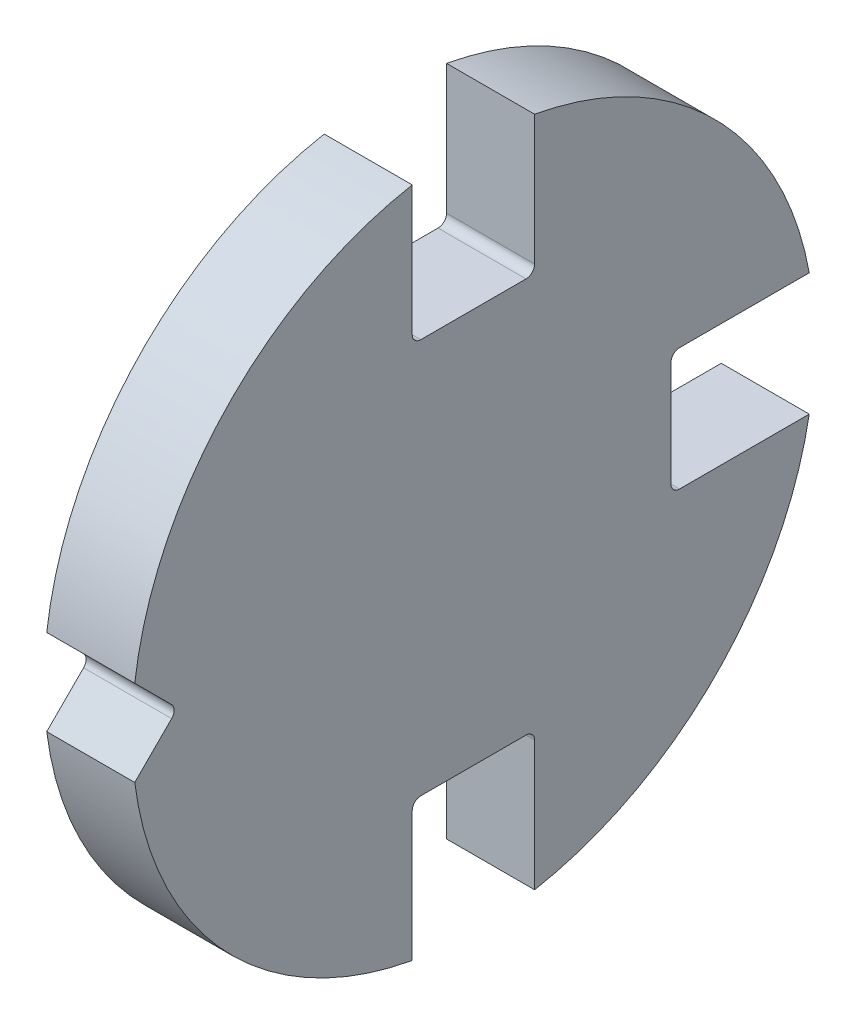
ISO-10303-21;
HEADER;
FILE_DESCRIPTION(('STEP AP214'),'2;1');
FILE_NAME('part.step','',(''),(''),'','','');
FILE_SCHEMA(('AUTOMOTIVE_DESIGN { 1 0 10303 214 1 1 1 1 }'));
ENDSEC;
DATA;
#1=APPLICATION_CONTEXT('core data for automotive mechanical design processes');
#2=APPLICATION_PROTOCOL_DEFINITION('international standard','automotive_design',2000,#1);
#3=PRODUCT_CONTEXT('',#1,'mechanical');
#4=PRODUCT('Part','Part','',(#3));
#5=PRODUCT_RELATED_PRODUCT_CATEGORY('part','',(#4));
#6=PRODUCT_DEFINITION_FORMATION('','',#4);
#7=PRODUCT_DEFINITION_CONTEXT('part definition',#1,'design');
#8=PRODUCT_DEFINITION('design','',#6,#7);
#9=PRODUCT_DEFINITION_SHAPE('','',#8);
#10=(LENGTH_UNIT() NAMED_UNIT(*) SI_UNIT(.MILLI.,.METRE.));
#11=(NAMED_UNIT(*) PLANE_ANGLE_UNIT() SI_UNIT($,.RADIAN.));
#12=(NAMED_UNIT(*) SI_UNIT($,.STERADIAN.) SOLID_ANGLE_UNIT());
#13=UNCERTAINTY_MEASURE_WITH_UNIT(LENGTH_MEASURE(1.E-05),#10,'distance_accuracy_value','');
#14=(GEOMETRIC_REPRESENTATION_CONTEXT(3) GLOBAL_UNCERTAINTY_ASSIGNED_CONTEXT((#13)) GLOBAL_UNIT_ASSIGNED_CONTEXT((#10,
#11,#12)) REPRESENTATION_CONTEXT('',''));
#15=CARTESIAN_POINT('',(0.,0.,0.));
#16=DIRECTION('',(0.,0.,1.));
#17=DIRECTION('',(1.,0.,0.));
#18=AXIS2_PLACEMENT_3D('',#15,#16,#17);
#19=CARTESIAN_POINT('',(69.14,0.,7.16969886701604));
#20=DIRECTION('',(1.,0.,0.));
#21=DIRECTION('',(0.,0.,-1.));
#22=AXIS2_PLACEMENT_3D('',#19,#20,#21);
#23=CYLINDRICAL_SURFACE('',#22,0.2);
#24=DIRECTION('',(1.,0.,0.));
#25=VECTOR('',#24,1.);
#26=CARTESIAN_POINT('',(70.165,0.14142135623743,7.02827751063743));
#27=LINE('',#26,#25);
#28=CARTESIAN_POINT('',(69.14,0.141421356272726,7.02827751067272));
#29=VERTEX_POINT('',#28);
#30=CARTESIAN_POINT('',(71.19,0.141421356231546,7.02827751070226));
#31=VERTEX_POINT('',#30);
#32=EDGE_CURVE('E176',#29,#31,#27,.T.);
#33=ORIENTED_EDGE('',*,*,#32,.F.);
#34=CARTESIAN_POINT('',(69.14,0.,7.16969886701604));
#35=DIRECTION('',(1.,0.,0.));
#36=DIRECTION('',(0.,0.,-1.));
#37=AXIS2_PLACEMENT_3D('',#34,#35,#36);
#38=CIRCLE('',#37,0.2);
#39=CARTESIAN_POINT('',(69.14,-0.141421356272666,7.02827751067266));
#40=VERTEX_POINT('',#39);
#41=EDGE_CURVE('E20',#40,#29,#38,.T.);
#42=ORIENTED_EDGE('',*,*,#41,.F.);
#43=DIRECTION('',(1.,0.,0.));
#44=VECTOR('',#43,1.);
#45=CARTESIAN_POINT('',(70.165,-0.141421356237311,7.02827751063731));
#46=LINE('',#45,#44);
#47=CARTESIAN_POINT('',(71.19,-0.141421356272666,7.02827751067267));
#48=VERTEX_POINT('',#47);
#49=EDGE_CURVE('E192',#48,#40,#46,.F.);
#50=ORIENTED_EDGE('',*,*,#49,.F.);
#51=CARTESIAN_POINT('',(71.19,0.,7.16969886701604));
#52=DIRECTION('',(1.,0.,0.));
#53=DIRECTION('',(0.,0.,-1.));
#54=AXIS2_PLACEMENT_3D('',#51,#52,#53);
#55=CIRCLE('',#54,0.2);
#56=EDGE_CURVE('E174',#31,#48,#55,.F.);
#57=ORIENTED_EDGE('',*,*,#56,.F.);
#58=EDGE_LOOP('',(#33,#42,#50,#57));
#59=FACE_BOUND('',#58,.T.);
#60=ADVANCED_FACE('F17',(#59),#23,.F.);
#61=CARTESIAN_POINT('',(70.165,0.500000000009512,7.38685615440951));
#62=DIRECTION('',(0.,-0.707106781186548,0.707106781186547));
#63=DIRECTION('',(0.,-0.707106781186547,-0.707106781186548));
#64=AXIS2_PLACEMENT_3D('',#61,#62,#63);
#65=PLANE('',#64);
#66=DIRECTION('',(1.,0.,0.));
#67=VECTOR('',#66,1.);
#68=CARTESIAN_POINT('',(70.165,1.00000000001478,7.88685615438563));
#69=LINE('',#68,#67);
#70=CARTESIAN_POINT('',(69.14,1.00000000000185,7.88685615438727));
#71=VERTEX_POINT('',#70);
#72=CARTESIAN_POINT('',(71.19,1.00000000000184,7.88685615438727));
#73=VERTEX_POINT('',#72);
#74=EDGE_CURVE('E182',#71,#73,#69,.T.);
#75=ORIENTED_EDGE('',*,*,#74,.F.);
#76=DIRECTION('',(0.,-0.707106781186547,-0.707106781186548));
#77=VECTOR('',#76,1.);
#78=CARTESIAN_POINT('',(69.14,0.500000000009512,7.38685615440951));
#79=LINE('',#78,#77);
#80=EDGE_CURVE('E170',#71,#29,#79,.T.);
#81=ORIENTED_EDGE('',*,*,#80,.T.);
#82=ORIENTED_EDGE('',*,*,#32,.T.);
#83=DIRECTION('',(0.,-0.70710678124478,-0.707106781128315));
#84=VECTOR('',#83,1.);
#85=CARTESIAN_POINT('',(71.19,1.00000000001902,7.88685615441903));
#86=LINE('',#85,#84);
#87=EDGE_CURVE('E228',#73,#31,#86,.T.);
#88=ORIENTED_EDGE('',*,*,#87,.F.);
#89=EDGE_LOOP('',(#75,#81,#82,#88));
#90=FACE_BOUND('',#89,.T.);
#91=ADVANCED_FACE('F180',(#90),#65,.T.);
#92=CARTESIAN_POINT('',(69.14,4.8000000001,1.2249999999));
#93=DIRECTION('',(1.,0.,0.));
#94=DIRECTION('',(0.,0.,-1.));
#95=AXIS2_PLACEMENT_3D('',#92,#93,#94);
#96=CYLINDRICAL_SURFACE('',#95,0.199999999999999);
#97=DIRECTION('',(1.,0.,0.));
#98=VECTOR('',#97,1.);
#99=CARTESIAN_POINT('',(69.14,4.6,1.225));
#100=LINE('',#99,#98);
#101=CARTESIAN_POINT('',(71.19,4.6,1.22499999995));
#102=VERTEX_POINT('',#101);
#103=CARTESIAN_POINT('',(69.14,4.6,1.22499999995));
#104=VERTEX_POINT('',#103);
#105=EDGE_CURVE('E297',#102,#104,#100,.F.);
#106=ORIENTED_EDGE('',*,*,#105,.T.);
#107=CARTESIAN_POINT('',(69.14,4.8000000001,1.2249999999));
#108=DIRECTION('',(1.,0.,0.));
#109=DIRECTION('',(0.,0.,-1.));
#110=AXIS2_PLACEMENT_3D('',#107,#108,#109);
#111=CIRCLE('',#110,0.199999999999999);
#112=CARTESIAN_POINT('',(69.14,4.80000000005009,1.425));
#113=VERTEX_POINT('',#112);
#114=EDGE_CURVE('E184',#113,#104,#111,.T.);
#115=ORIENTED_EDGE('',*,*,#114,.F.);
#116=DIRECTION('',(1.,0.,0.));
#117=VECTOR('',#116,1.);
#118=CARTESIAN_POINT('',(69.14,4.80000000000017,1.425));
#119=LINE('',#118,#117);
#120=CARTESIAN_POINT('',(71.19,4.80000000005009,1.425));
#121=VERTEX_POINT('',#120);
#122=EDGE_CURVE('E224',#113,#121,#119,.T.);
#123=ORIENTED_EDGE('',*,*,#122,.T.);
#124=CARTESIAN_POINT('',(71.19,4.8000000001,1.2249999999));
#125=DIRECTION('',(1.,0.,0.));
#126=DIRECTION('',(0.,0.,-1.));
#127=AXIS2_PLACEMENT_3D('',#124,#125,#126);
#128=CIRCLE('',#127,0.199999999999999);
#129=EDGE_CURVE('E225',#102,#121,#128,.F.);
#130=ORIENTED_EDGE('',*,*,#129,.F.);
#131=EDGE_LOOP('',(#106,#115,#123,#130));
#132=FACE_BOUND('',#131,.T.);
#133=ADVANCED_FACE('F439',(#132),#96,.F.);
#134=CARTESIAN_POINT('',(69.14,4.8000000001,-1.2249999999));
#135=DIRECTION('',(1.,0.,0.));
#136=DIRECTION('',(0.,0.,-1.));
#137=AXIS2_PLACEMENT_3D('',#134,#135,#136);
#138=CYLINDRICAL_SURFACE('',#137,0.200000000000003);
#139=DIRECTION('',(-1.,0.,0.));
#140=VECTOR('',#139,1.);
#141=CARTESIAN_POINT('',(69.14,4.8,-1.425));
#142=LINE('',#141,#140);
#143=CARTESIAN_POINT('',(71.19,4.80000000005,-1.425));
#144=VERTEX_POINT('',#143);
#145=CARTESIAN_POINT('',(69.14,4.80000000005,-1.425));
#146=VERTEX_POINT('',#145);
#147=EDGE_CURVE('E291',#144,#146,#142,.T.);
#148=ORIENTED_EDGE('',*,*,#147,.T.);
#149=CARTESIAN_POINT('',(69.14,4.8000000001,-1.2249999999));
#150=DIRECTION('',(1.,0.,0.));
#151=DIRECTION('',(0.,0.,-1.));
#152=AXIS2_PLACEMENT_3D('',#149,#150,#151);
#153=CIRCLE('',#152,0.200000000000003);
#154=CARTESIAN_POINT('',(69.14,4.6,-1.22499999994992));
#155=VERTEX_POINT('',#154);
#156=EDGE_CURVE('E186',#155,#146,#153,.T.);
#157=ORIENTED_EDGE('',*,*,#156,.F.);
#158=DIRECTION('',(1.,0.,0.));
#159=VECTOR('',#158,1.);
#160=CARTESIAN_POINT('',(69.14,4.6,-1.22499999999983));
#161=LINE('',#160,#159);
#162=CARTESIAN_POINT('',(71.19,4.6,-1.22499999994992));
#163=VERTEX_POINT('',#162);
#164=EDGE_CURVE('E294',#155,#163,#161,.T.);
#165=ORIENTED_EDGE('',*,*,#164,.T.);
#166=CARTESIAN_POINT('',(71.19,4.8000000001,-1.2249999999));
#167=DIRECTION('',(1.,0.,0.));
#168=DIRECTION('',(0.,0.,-1.));
#169=AXIS2_PLACEMENT_3D('',#166,#167,#168);
#170=CIRCLE('',#169,0.200000000000003);
#171=EDGE_CURVE('E229',#144,#163,#170,.F.);
#172=ORIENTED_EDGE('',*,*,#171,.F.);
#173=EDGE_LOOP('',(#148,#157,#165,#172));
#174=FACE_BOUND('',#173,.T.);
#175=ADVANCED_FACE('F344',(#174),#138,.F.);
#176=CARTESIAN_POINT('',(69.14,1.2249999999,-4.8000000001));
#177=DIRECTION('',(1.,0.,0.));
#178=DIRECTION('',(0.,0.,-1.));
#179=AXIS2_PLACEMENT_3D('',#176,#177,#178);
#180=CYLINDRICAL_SURFACE('',#179,0.199999999999999);
#181=DIRECTION('',(1.,0.,0.));
#182=VECTOR('',#181,1.);
#183=CARTESIAN_POINT('',(69.14,1.225,-4.6));
#184=LINE('',#183,#182);
#185=CARTESIAN_POINT('',(71.19,1.22499999995,-4.6));
#186=VERTEX_POINT('',#185);
#187=CARTESIAN_POINT('',(69.14,1.22499999995,-4.6));
#188=VERTEX_POINT('',#187);
#189=EDGE_CURVE('E334',#186,#188,#184,.F.);
#190=ORIENTED_EDGE('',*,*,#189,.T.);
#191=CARTESIAN_POINT('',(69.14,1.2249999999,-4.8000000001));
#192=DIRECTION('',(1.,0.,0.));
#193=DIRECTION('',(0.,0.,-1.));
#194=AXIS2_PLACEMENT_3D('',#191,#192,#193);
#195=CIRCLE('',#194,0.199999999999999);
#196=CARTESIAN_POINT('',(69.14,1.425,-4.80000000005009));
#197=VERTEX_POINT('',#196);
#198=EDGE_CURVE('E250',#197,#188,#195,.T.);
#199=ORIENTED_EDGE('',*,*,#198,.F.);
#200=DIRECTION('',(1.,0.,0.));
#201=VECTOR('',#200,1.);
#202=CARTESIAN_POINT('',(69.14,1.425,-4.80000000000017));
#203=LINE('',#202,#201);
#204=CARTESIAN_POINT('',(71.19,1.425,-4.80000000005009));
#205=VERTEX_POINT('',#204);
#206=EDGE_CURVE('E219',#197,#205,#203,.T.);
#207=ORIENTED_EDGE('',*,*,#206,.T.);
#208=CARTESIAN_POINT('',(71.19,1.2249999999,-4.8000000001));
#209=DIRECTION('',(1.,0.,0.));
#210=DIRECTION('',(0.,0.,-1.));
#211=AXIS2_PLACEMENT_3D('',#208,#209,#210);
#212=CIRCLE('',#211,0.199999999999999);
#213=EDGE_CURVE('E232',#186,#205,#212,.F.);
#214=ORIENTED_EDGE('',*,*,#213,.F.);
#215=EDGE_LOOP('',(#190,#199,#207,#214));
#216=FACE_BOUND('',#215,.T.);
#217=ADVANCED_FACE('F432',(#216),#180,.F.);
#218=CARTESIAN_POINT('',(69.14,-1.2249999999,-4.8000000001));
#219=DIRECTION('',(1.,0.,0.));
#220=DIRECTION('',(0.,0.,-1.));
#221=AXIS2_PLACEMENT_3D('',#218,#219,#220);
#222=CYLINDRICAL_SURFACE('',#221,0.200000000000003);
#223=DIRECTION('',(1.,0.,0.));
#224=VECTOR('',#223,1.);
#225=CARTESIAN_POINT('',(69.14,-1.425,-4.8));
#226=LINE('',#225,#224);
#227=CARTESIAN_POINT('',(71.19,-1.425,-4.80000000005));
#228=VERTEX_POINT('',#227);
#229=CARTESIAN_POINT('',(69.14,-1.425,-4.80000000005));
#230=VERTEX_POINT('',#229);
#231=EDGE_CURVE('E281',#228,#230,#226,.F.);
#232=ORIENTED_EDGE('',*,*,#231,.T.);
#233=CARTESIAN_POINT('',(69.14,-1.2249999999,-4.8000000001));
#234=DIRECTION('',(1.,0.,0.));
#235=DIRECTION('',(0.,0.,-1.));
#236=AXIS2_PLACEMENT_3D('',#233,#234,#235);
#237=CIRCLE('',#236,0.200000000000003);
#238=CARTESIAN_POINT('',(69.14,-1.22499999994992,-4.6));
#239=VERTEX_POINT('',#238);
#240=EDGE_CURVE('E248',#239,#230,#237,.T.);
#241=ORIENTED_EDGE('',*,*,#240,.F.);
#242=DIRECTION('',(1.,0.,0.));
#243=VECTOR('',#242,1.);
#244=CARTESIAN_POINT('',(69.14,-1.22499999999983,-4.6));
#245=LINE('',#244,#243);
#246=CARTESIAN_POINT('',(71.19,-1.22499999994992,-4.6));
#247=VERTEX_POINT('',#246);
#248=EDGE_CURVE('E285',#239,#247,#245,.T.);
#249=ORIENTED_EDGE('',*,*,#248,.T.);
#250=CARTESIAN_POINT('',(71.19,-1.2249999999,-4.8000000001));
#251=DIRECTION('',(1.,0.,0.));
#252=DIRECTION('',(0.,0.,-1.));
#253=AXIS2_PLACEMENT_3D('',#250,#251,#252);
#254=CIRCLE('',#253,0.200000000000003);
#255=EDGE_CURVE('E235',#228,#247,#254,.F.);
#256=ORIENTED_EDGE('',*,*,#255,.F.);
#257=EDGE_LOOP('',(#232,#241,#249,#256));
#258=FACE_BOUND('',#257,.T.);
#259=ADVANCED_FACE('F428',(#258),#222,.F.);
#260=CARTESIAN_POINT('',(69.14,-4.8000000001,-1.2249999999));
#261=DIRECTION('',(1.,0.,0.));
#262=DIRECTION('',(0.,0.,-1.));
#263=AXIS2_PLACEMENT_3D('',#260,#261,#262);
#264=CYLINDRICAL_SURFACE('',#263,0.199999999999999);
#265=DIRECTION('',(1.,0.,0.));
#266=VECTOR('',#265,1.);
#267=CARTESIAN_POINT('',(69.14,-4.6,-1.225));
#268=LINE('',#267,#266);
#269=CARTESIAN_POINT('',(71.19,-4.6,-1.22499999995));
#270=VERTEX_POINT('',#269);
#271=CARTESIAN_POINT('',(69.14,-4.6,-1.22499999995));
#272=VERTEX_POINT('',#271);
#273=EDGE_CURVE('E324',#270,#272,#268,.F.);
#274=ORIENTED_EDGE('',*,*,#273,.T.);
#275=CARTESIAN_POINT('',(69.14,-4.8000000001,-1.2249999999));
#276=DIRECTION('',(1.,0.,0.));
#277=DIRECTION('',(0.,0.,-1.));
#278=AXIS2_PLACEMENT_3D('',#275,#276,#277);
#279=CIRCLE('',#278,0.199999999999999);
#280=CARTESIAN_POINT('',(69.14,-4.80000000005009,-1.425));
#281=VERTEX_POINT('',#280);
#282=EDGE_CURVE('E246',#281,#272,#279,.T.);
#283=ORIENTED_EDGE('',*,*,#282,.F.);
#284=DIRECTION('',(-1.,0.,0.));
#285=VECTOR('',#284,1.);
#286=CARTESIAN_POINT('',(69.14,-4.80000000000017,-1.425));
#287=LINE('',#286,#285);
#288=CARTESIAN_POINT('',(71.19,-4.80000000005009,-1.425));
#289=VERTEX_POINT('',#288);
#290=EDGE_CURVE('E214',#281,#289,#287,.F.);
#291=ORIENTED_EDGE('',*,*,#290,.T.);
#292=CARTESIAN_POINT('',(71.19,-4.8000000001,-1.2249999999));
#293=DIRECTION('',(1.,0.,0.));
#294=DIRECTION('',(0.,0.,-1.));
#295=AXIS2_PLACEMENT_3D('',#292,#293,#294);
#296=CIRCLE('',#295,0.199999999999999);
#297=EDGE_CURVE('E238',#270,#289,#296,.F.);
#298=ORIENTED_EDGE('',*,*,#297,.F.);
#299=EDGE_LOOP('',(#274,#283,#291,#298));
#300=FACE_BOUND('',#299,.T.);
#301=ADVANCED_FACE('F425',(#300),#264,.F.);
#302=CARTESIAN_POINT('',(69.14,-4.8000000001,1.2249999999));
#303=DIRECTION('',(1.,0.,0.));
#304=DIRECTION('',(0.,0.,-1.));
#305=AXIS2_PLACEMENT_3D('',#302,#303,#304);
#306=CYLINDRICAL_SURFACE('',#305,0.200000000000003);
#307=DIRECTION('',(1.,0.,0.));
#308=VECTOR('',#307,1.);
#309=CARTESIAN_POINT('',(69.14,-4.8,1.425));
#310=LINE('',#309,#308);
#311=CARTESIAN_POINT('',(71.19,-4.80000000005,1.425));
#312=VERTEX_POINT('',#311);
#313=CARTESIAN_POINT('',(69.14,-4.80000000005,1.425));
#314=VERTEX_POINT('',#313);
#315=EDGE_CURVE('E269',#312,#314,#310,.F.);
#316=ORIENTED_EDGE('',*,*,#315,.T.);
#317=CARTESIAN_POINT('',(69.14,-4.8000000001,1.2249999999));
#318=DIRECTION('',(1.,0.,0.));
#319=DIRECTION('',(0.,0.,-1.));
#320=AXIS2_PLACEMENT_3D('',#317,#318,#319);
#321=CIRCLE('',#320,0.200000000000003);
#322=CARTESIAN_POINT('',(69.14,-4.6,1.22499999994992));
#323=VERTEX_POINT('',#322);
#324=EDGE_CURVE('E193',#323,#314,#321,.T.);
#325=ORIENTED_EDGE('',*,*,#324,.F.);
#326=DIRECTION('',(1.,0.,0.));
#327=VECTOR('',#326,1.);
#328=CARTESIAN_POINT('',(69.14,-4.6,1.22499999999983));
#329=LINE('',#328,#327);
#330=CARTESIAN_POINT('',(71.19,-4.6,1.22499999994992));
#331=VERTEX_POINT('',#330);
#332=EDGE_CURVE('E274',#323,#331,#329,.T.);
#333=ORIENTED_EDGE('',*,*,#332,.T.);
#334=CARTESIAN_POINT('',(71.19,-4.8000000001,1.2249999999));
#335=DIRECTION('',(1.,0.,0.));
#336=DIRECTION('',(0.,0.,-1.));
#337=AXIS2_PLACEMENT_3D('',#334,#335,#336);
#338=CIRCLE('',#337,0.200000000000003);
#339=EDGE_CURVE('E241',#312,#331,#338,.F.);
#340=ORIENTED_EDGE('',*,*,#339,.F.);
#341=EDGE_LOOP('',(#316,#325,#333,#340));
#342=FACE_BOUND('',#341,.T.);
#343=ADVANCED_FACE('F365',(#342),#306,.F.);
#344=CARTESIAN_POINT('',(70.165,-0.500000000009513,7.38685615440951));
#345=DIRECTION('',(0.,0.707106781186547,0.707106781186548));
#346=DIRECTION('',(0.,-0.707106781186548,0.707106781186547));
#347=AXIS2_PLACEMENT_3D('',#344,#345,#346);
#348=PLANE('',#347);
#349=DIRECTION('',(1.,0.,0.));
#350=VECTOR('',#349,1.);
#351=CARTESIAN_POINT('',(70.165,-1.00000000001479,7.88685615438563));
#352=LINE('',#351,#350);
#353=CARTESIAN_POINT('',(71.19,-1.00000000000185,7.88685615438727));
#354=VERTEX_POINT('',#353);
#355=CARTESIAN_POINT('',(69.14,-1.00000000000185,7.88685615438727));
#356=VERTEX_POINT('',#355);
#357=EDGE_CURVE('E261',#354,#356,#352,.F.);
#358=ORIENTED_EDGE('',*,*,#357,.F.);
#359=DIRECTION('',(0.,-0.707106781186547,0.707106781186548));
#360=VECTOR('',#359,1.);
#361=CARTESIAN_POINT('',(71.19,-0.14142135623731,7.02827751063731));
#362=LINE('',#361,#360);
#363=EDGE_CURVE('E244',#48,#354,#362,.T.);
#364=ORIENTED_EDGE('',*,*,#363,.F.);
#365=ORIENTED_EDGE('',*,*,#49,.T.);
#366=DIRECTION('',(0.,-0.707106781186548,0.707106781186547));
#367=VECTOR('',#366,1.);
#368=CARTESIAN_POINT('',(69.14,-0.500000000009513,7.38685615440951));
#369=LINE('',#368,#367);
#370=EDGE_CURVE('E172',#40,#356,#369,.T.);
#371=ORIENTED_EDGE('',*,*,#370,.T.);
#372=EDGE_LOOP('',(#358,#364,#365,#371));
#373=FACE_BOUND('',#372,.T.);
#374=ADVANCED_FACE('F259',(#373),#348,.T.);
#375=CARTESIAN_POINT('',(71.19,0.,3.975));
#376=DIRECTION('',(1.,0.,0.));
#377=DIRECTION('',(0.,0.,-1.));
#378=AXIS2_PLACEMENT_3D('',#375,#376,#377);
#379=PLANE('',#378);
#380=ORIENTED_EDGE('',*,*,#87,.T.);
#381=ORIENTED_EDGE('',*,*,#56,.T.);
#382=ORIENTED_EDGE('',*,*,#363,.T.);
#383=CARTESIAN_POINT('',(71.19,0.,0.));
#384=DIRECTION('',(1.,0.,0.));
#385=DIRECTION('',(0.,0.,-1.));
#386=AXIS2_PLACEMENT_3D('',#383,#384,#385);
#387=CIRCLE('',#386,7.95);
#388=CARTESIAN_POINT('',(71.19,-7.82124510548033,1.425));
#389=VERTEX_POINT('',#388);
#390=EDGE_CURVE('E208',#389,#354,#387,.F.);
#391=ORIENTED_EDGE('',*,*,#390,.F.);
#392=DIRECTION('',(0.,1.,0.));
#393=VECTOR('',#392,1.);
#394=CARTESIAN_POINT('',(71.19,-9.8,1.425));
#395=LINE('',#394,#393);
#396=EDGE_CURVE('E267',#389,#312,#395,.T.);
#397=ORIENTED_EDGE('',*,*,#396,.T.);
#398=ORIENTED_EDGE('',*,*,#339,.T.);
#399=DIRECTION('',(0.,0.,1.));
#400=VECTOR('',#399,1.);
#401=CARTESIAN_POINT('',(71.19,-4.6,-0.6125));
#402=LINE('',#401,#400);
#403=EDGE_CURVE('E270',#331,#270,#402,.F.);
#404=ORIENTED_EDGE('',*,*,#403,.T.);
#405=ORIENTED_EDGE('',*,*,#297,.T.);
#406=DIRECTION('',(0.,1.,0.));
#407=VECTOR('',#406,1.);
#408=CARTESIAN_POINT('',(71.19,-9.80000000000008,-1.425));
#409=LINE('',#408,#407);
#410=CARTESIAN_POINT('',(71.19,-7.82124510548033,-1.425));
#411=VERTEX_POINT('',#410);
#412=EDGE_CURVE('E275',#289,#411,#409,.F.);
#413=ORIENTED_EDGE('',*,*,#412,.T.);
#414=CARTESIAN_POINT('',(71.19,0.,0.));
#415=DIRECTION('',(1.,0.,0.));
#416=DIRECTION('',(0.,0.,-1.));
#417=AXIS2_PLACEMENT_3D('',#414,#415,#416);
#418=CIRCLE('',#417,7.95);
#419=CARTESIAN_POINT('',(71.19,-1.425,-7.82124510548033));
#420=VERTEX_POINT('',#419);
#421=EDGE_CURVE('E211',#420,#411,#418,.F.);
#422=ORIENTED_EDGE('',*,*,#421,.F.);
#423=DIRECTION('',(0.,0.,-1.));
#424=VECTOR('',#423,1.);
#425=CARTESIAN_POINT('',(71.19,-1.425,-9.8));
#426=LINE('',#425,#424);
#427=EDGE_CURVE('E278',#420,#228,#426,.F.);
#428=ORIENTED_EDGE('',*,*,#427,.T.);
#429=ORIENTED_EDGE('',*,*,#255,.T.);
#430=DIRECTION('',(0.,1.,0.));
#431=VECTOR('',#430,1.);
#432=CARTESIAN_POINT('',(71.19,0.6125,-4.6));
#433=LINE('',#432,#431);
#434=EDGE_CURVE('E282',#247,#186,#433,.T.);
#435=ORIENTED_EDGE('',*,*,#434,.T.);
#436=ORIENTED_EDGE('',*,*,#213,.T.);
#437=DIRECTION('',(0.,0.,1.));
#438=VECTOR('',#437,1.);
#439=CARTESIAN_POINT('',(71.19,1.425,-9.80000000000008));
#440=LINE('',#439,#438);
#441=CARTESIAN_POINT('',(71.19,1.425,-7.82124510548033));
#442=VERTEX_POINT('',#441);
#443=EDGE_CURVE('E286',#205,#442,#440,.F.);
#444=ORIENTED_EDGE('',*,*,#443,.T.);
#445=CARTESIAN_POINT('',(71.19,0.,0.));
#446=DIRECTION('',(1.,0.,0.));
#447=DIRECTION('',(0.,0.,-1.));
#448=AXIS2_PLACEMENT_3D('',#445,#446,#447);
#449=CIRCLE('',#448,7.95);
#450=CARTESIAN_POINT('',(71.19,7.82124510548033,-1.425));
#451=VERTEX_POINT('',#450);
#452=EDGE_CURVE('E216',#451,#442,#449,.F.);
#453=ORIENTED_EDGE('',*,*,#452,.F.);
#454=DIRECTION('',(0.,1.,0.));
#455=VECTOR('',#454,1.);
#456=CARTESIAN_POINT('',(71.19,9.8,-1.425));
#457=LINE('',#456,#455);
#458=EDGE_CURVE('E289',#451,#144,#457,.F.);
#459=ORIENTED_EDGE('',*,*,#458,.T.);
#460=ORIENTED_EDGE('',*,*,#171,.T.);
#461=DIRECTION('',(0.,0.,-1.));
#462=VECTOR('',#461,1.);
#463=CARTESIAN_POINT('',(71.19,4.6,0.6125));
#464=LINE('',#463,#462);
#465=EDGE_CURVE('E292',#163,#102,#464,.F.);
#466=ORIENTED_EDGE('',*,*,#465,.T.);
#467=ORIENTED_EDGE('',*,*,#129,.T.);
#468=DIRECTION('',(0.,1.,0.));
#469=VECTOR('',#468,1.);
#470=CARTESIAN_POINT('',(71.19,9.80000000000008,1.425));
#471=LINE('',#470,#469);
#472=CARTESIAN_POINT('',(71.19,7.82124510548033,1.425));
#473=VERTEX_POINT('',#472);
#474=EDGE_CURVE('E189',#121,#473,#471,.T.);
#475=ORIENTED_EDGE('',*,*,#474,.T.);
#476=CARTESIAN_POINT('',(71.19,0.,0.));
#477=DIRECTION('',(1.,0.,0.));
#478=DIRECTION('',(0.,0.,-1.));
#479=AXIS2_PLACEMENT_3D('',#476,#477,#478);
#480=CIRCLE('',#479,7.95);
#481=EDGE_CURVE('E221',#73,#473,#480,.F.);
#482=ORIENTED_EDGE('',*,*,#481,.F.);
#483=EDGE_LOOP('',(#380,#381,#382,#391,#397,#398,#404,#405,#413,#422,#428,#429,#435,#436,#444,
#453,#459,#460,#466,#467,#475,#482));
#484=FACE_BOUND('',#483,.T.);
#485=ADVANCED_FACE('F254',(#484),#379,.T.);
#486=CARTESIAN_POINT('',(70.165,0.,0.));
#487=DIRECTION('',(1.,0.,0.));
#488=DIRECTION('',(0.,0.,-1.));
#489=AXIS2_PLACEMENT_3D('',#486,#487,#488);
#490=CYLINDRICAL_SURFACE('',#489,7.95);
#491=DIRECTION('',(1.,0.,0.));
#492=VECTOR('',#491,1.);
#493=CARTESIAN_POINT('',(69.14,7.82124510548033,1.425));
#494=LINE('',#493,#492);
#495=CARTESIAN_POINT('',(69.14,7.82124510548033,1.425));
#496=VERTEX_POINT('',#495);
#497=EDGE_CURVE('E302',#473,#496,#494,.F.);
#498=ORIENTED_EDGE('',*,*,#497,.T.);
#499=CARTESIAN_POINT('',(69.14,0.,0.));
#500=DIRECTION('',(1.,0.,0.));
#501=DIRECTION('',(0.,0.,-1.));
#502=AXIS2_PLACEMENT_3D('',#499,#500,#501);
#503=CIRCLE('',#502,7.95);
#504=EDGE_CURVE('E205',#71,#496,#503,.F.);
#505=ORIENTED_EDGE('',*,*,#504,.F.);
#506=ORIENTED_EDGE('',*,*,#74,.T.);
#507=ORIENTED_EDGE('',*,*,#481,.T.);
#508=EDGE_LOOP('',(#498,#505,#506,#507));
#509=FACE_BOUND('',#508,.T.);
#510=ADVANCED_FACE('F308',(#509),#490,.T.);
#511=CARTESIAN_POINT('',(69.14,9.80000000000008,1.425));
#512=DIRECTION('',(0.,0.,1.));
#513=DIRECTION('',(1.,0.,0.));
#514=AXIS2_PLACEMENT_3D('',#511,#512,#513);
#515=PLANE('',#514);
#516=ORIENTED_EDGE('',*,*,#474,.F.);
#517=ORIENTED_EDGE('',*,*,#122,.F.);
#518=DIRECTION('',(0.,1.,0.));
#519=VECTOR('',#518,1.);
#520=CARTESIAN_POINT('',(69.14,0.,1.425));
#521=LINE('',#520,#519);
#522=EDGE_CURVE('E207',#496,#113,#521,.F.);
#523=ORIENTED_EDGE('',*,*,#522,.F.);
#524=ORIENTED_EDGE('',*,*,#497,.F.);
#525=EDGE_LOOP('',(#516,#517,#523,#524));
#526=FACE_BOUND('',#525,.T.);
#527=ADVANCED_FACE('F413',(#526),#515,.F.);
#528=CARTESIAN_POINT('',(69.14,4.6,0.6125));
#529=DIRECTION('',(0.,-1.,0.));
#530=DIRECTION('',(0.,0.,-1.));
#531=AXIS2_PLACEMENT_3D('',#528,#529,#530);
#532=PLANE('',#531);
#533=ORIENTED_EDGE('',*,*,#164,.F.);
#534=DIRECTION('',(0.,0.,1.));
#535=VECTOR('',#534,1.);
#536=CARTESIAN_POINT('',(69.14,4.6,3.975));
#537=LINE('',#536,#535);
#538=EDGE_CURVE('E315',#104,#155,#537,.F.);
#539=ORIENTED_EDGE('',*,*,#538,.F.);
#540=ORIENTED_EDGE('',*,*,#105,.F.);
#541=ORIENTED_EDGE('',*,*,#465,.F.);
#542=EDGE_LOOP('',(#533,#539,#540,#541));
#543=FACE_BOUND('',#542,.T.);
#544=ADVANCED_FACE('F410',(#543),#532,.F.);
#545=CARTESIAN_POINT('',(69.14,9.8,-1.425));
#546=DIRECTION('',(0.,0.,-1.));
#547=DIRECTION('',(-1.,0.,0.));
#548=AXIS2_PLACEMENT_3D('',#545,#546,#547);
#549=PLANE('',#548);
#550=DIRECTION('',(0.,1.,0.));
#551=VECTOR('',#550,1.);
#552=CARTESIAN_POINT('',(69.14,0.,-1.425));
#553=LINE('',#552,#551);
#554=CARTESIAN_POINT('',(69.14,7.82124510548033,-1.425));
#555=VERTEX_POINT('',#554);
#556=EDGE_CURVE('E204',#146,#555,#553,.T.);
#557=ORIENTED_EDGE('',*,*,#556,.F.);
#558=ORIENTED_EDGE('',*,*,#147,.F.);
#559=ORIENTED_EDGE('',*,*,#458,.F.);
#560=DIRECTION('',(1.,0.,0.));
#561=VECTOR('',#560,1.);
#562=CARTESIAN_POINT('',(70.165,7.82124510548033,-1.425));
#563=LINE('',#562,#561);
#564=EDGE_CURVE('E220',#555,#451,#563,.T.);
#565=ORIENTED_EDGE('',*,*,#564,.F.);
#566=EDGE_LOOP('',(#557,#558,#559,#565));
#567=FACE_BOUND('',#566,.T.);
#568=ADVANCED_FACE('F347',(#567),#549,.F.);
#569=CARTESIAN_POINT('',(70.165,0.,0.));
#570=DIRECTION('',(1.,0.,0.));
#571=DIRECTION('',(0.,0.,-1.));
#572=AXIS2_PLACEMENT_3D('',#569,#570,#571);
#573=CYLINDRICAL_SURFACE('',#572,7.95);
#574=ORIENTED_EDGE('',*,*,#564,.T.);
#575=ORIENTED_EDGE('',*,*,#452,.T.);
#576=DIRECTION('',(1.,0.,0.));
#577=VECTOR('',#576,1.);
#578=CARTESIAN_POINT('',(69.14,1.425,-7.82124510548033));
#579=LINE('',#578,#577);
#580=CARTESIAN_POINT('',(69.14,1.425,-7.82124510548033));
#581=VERTEX_POINT('',#580);
#582=EDGE_CURVE('E288',#442,#581,#579,.F.);
#583=ORIENTED_EDGE('',*,*,#582,.T.);
#584=CARTESIAN_POINT('',(69.14,0.,0.));
#585=DIRECTION('',(1.,0.,0.));
#586=DIRECTION('',(0.,0.,-1.));
#587=AXIS2_PLACEMENT_3D('',#584,#585,#586);
#588=CIRCLE('',#587,7.95);
#589=EDGE_CURVE('E200',#555,#581,#588,.F.);
#590=ORIENTED_EDGE('',*,*,#589,.F.);
#591=EDGE_LOOP('',(#574,#575,#583,#590));
#592=FACE_BOUND('',#591,.T.);
#593=ADVANCED_FACE('F403',(#592),#573,.T.);
#594=CARTESIAN_POINT('',(69.14,1.425,-9.80000000000008));
#595=DIRECTION('',(0.,1.,0.));
#596=DIRECTION('',(0.,0.,1.));
#597=AXIS2_PLACEMENT_3D('',#594,#595,#596);
#598=PLANE('',#597);
#599=ORIENTED_EDGE('',*,*,#443,.F.);
#600=ORIENTED_EDGE('',*,*,#206,.F.);
#601=DIRECTION('',(0.,0.,1.));
#602=VECTOR('',#601,1.);
#603=CARTESIAN_POINT('',(69.14,1.425,3.975));
#604=LINE('',#603,#602);
#605=EDGE_CURVE('E203',#581,#197,#604,.T.);
#606=ORIENTED_EDGE('',*,*,#605,.F.);
#607=ORIENTED_EDGE('',*,*,#582,.F.);
#608=EDGE_LOOP('',(#599,#600,#606,#607));
#609=FACE_BOUND('',#608,.T.);
#610=ADVANCED_FACE('F399',(#609),#598,.F.);
#611=CARTESIAN_POINT('',(69.14,0.6125,-4.6));
#612=DIRECTION('',(0.,0.,1.));
#613=DIRECTION('',(1.,0.,0.));
#614=AXIS2_PLACEMENT_3D('',#611,#612,#613);
#615=PLANE('',#614);
#616=ORIENTED_EDGE('',*,*,#248,.F.);
#617=DIRECTION('',(0.,1.,0.));
#618=VECTOR('',#617,1.);
#619=CARTESIAN_POINT('',(69.14,0.,-4.6));
#620=LINE('',#619,#618);
#621=EDGE_CURVE('E352',#188,#239,#620,.F.);
#622=ORIENTED_EDGE('',*,*,#621,.F.);
#623=ORIENTED_EDGE('',*,*,#189,.F.);
#624=ORIENTED_EDGE('',*,*,#434,.F.);
#625=EDGE_LOOP('',(#616,#622,#623,#624));
#626=FACE_BOUND('',#625,.T.);
#627=ADVANCED_FACE('F395',(#626),#615,.F.);
#628=CARTESIAN_POINT('',(69.14,-1.425,-9.8));
#629=DIRECTION('',(0.,-1.,0.));
#630=DIRECTION('',(0.,0.,-1.));
#631=AXIS2_PLACEMENT_3D('',#628,#629,#630);
#632=PLANE('',#631);
#633=DIRECTION('',(0.,0.,1.));
#634=VECTOR('',#633,1.);
#635=CARTESIAN_POINT('',(69.14,-1.425,3.975));
#636=LINE('',#635,#634);
#637=CARTESIAN_POINT('',(69.14,-1.425,-7.82124510548033));
#638=VERTEX_POINT('',#637);
#639=EDGE_CURVE('E199',#230,#638,#636,.F.);
#640=ORIENTED_EDGE('',*,*,#639,.F.);
#641=ORIENTED_EDGE('',*,*,#231,.F.);
#642=ORIENTED_EDGE('',*,*,#427,.F.);
#643=DIRECTION('',(1.,0.,0.));
#644=VECTOR('',#643,1.);
#645=CARTESIAN_POINT('',(70.165,-1.425,-7.82124510548033));
#646=LINE('',#645,#644);
#647=EDGE_CURVE('E215',#638,#420,#646,.T.);
#648=ORIENTED_EDGE('',*,*,#647,.F.);
#649=EDGE_LOOP('',(#640,#641,#642,#648));
#650=FACE_BOUND('',#649,.T.);
#651=ADVANCED_FACE('F391',(#650),#632,.F.);
#652=CARTESIAN_POINT('',(70.165,0.,0.));
#653=DIRECTION('',(1.,0.,0.));
#654=DIRECTION('',(0.,0.,-1.));
#655=AXIS2_PLACEMENT_3D('',#652,#653,#654);
#656=CYLINDRICAL_SURFACE('',#655,7.95);
#657=ORIENTED_EDGE('',*,*,#647,.T.);
#658=ORIENTED_EDGE('',*,*,#421,.T.);
#659=DIRECTION('',(-1.,0.,0.));
#660=VECTOR('',#659,1.);
#661=CARTESIAN_POINT('',(69.14,-7.82124510548033,-1.425));
#662=LINE('',#661,#660);
#663=CARTESIAN_POINT('',(69.14,-7.82124510548033,-1.425));
#664=VERTEX_POINT('',#663);
#665=EDGE_CURVE('E277',#411,#664,#662,.T.);
#666=ORIENTED_EDGE('',*,*,#665,.T.);
#667=CARTESIAN_POINT('',(69.14,0.,0.));
#668=DIRECTION('',(1.,0.,0.));
#669=DIRECTION('',(0.,0.,-1.));
#670=AXIS2_PLACEMENT_3D('',#667,#668,#669);
#671=CIRCLE('',#670,7.95);
#672=EDGE_CURVE('E195',#638,#664,#671,.F.);
#673=ORIENTED_EDGE('',*,*,#672,.F.);
#674=EDGE_LOOP('',(#657,#658,#666,#673));
#675=FACE_BOUND('',#674,.T.);
#676=ADVANCED_FACE('F387',(#675),#656,.T.);
#677=CARTESIAN_POINT('',(69.14,-9.80000000000008,-1.425));
#678=DIRECTION('',(0.,0.,-1.));
#679=DIRECTION('',(-1.,0.,0.));
#680=AXIS2_PLACEMENT_3D('',#677,#678,#679);
#681=PLANE('',#680);
#682=ORIENTED_EDGE('',*,*,#412,.F.);
#683=ORIENTED_EDGE('',*,*,#290,.F.);
#684=DIRECTION('',(0.,1.,0.));
#685=VECTOR('',#684,1.);
#686=CARTESIAN_POINT('',(69.14,0.,-1.425));
#687=LINE('',#686,#685);
#688=EDGE_CURVE('E198',#664,#281,#687,.T.);
#689=ORIENTED_EDGE('',*,*,#688,.F.);
#690=ORIENTED_EDGE('',*,*,#665,.F.);
#691=EDGE_LOOP('',(#682,#683,#689,#690));
#692=FACE_BOUND('',#691,.T.);
#693=ADVANCED_FACE('F383',(#692),#681,.F.);
#694=CARTESIAN_POINT('',(69.14,-4.6,-0.6125));
#695=DIRECTION('',(0.,1.,0.));
#696=DIRECTION('',(0.,0.,1.));
#697=AXIS2_PLACEMENT_3D('',#694,#695,#696);
#698=PLANE('',#697);
#699=ORIENTED_EDGE('',*,*,#332,.F.);
#700=DIRECTION('',(0.,0.,1.));
#701=VECTOR('',#700,1.);
#702=CARTESIAN_POINT('',(69.14,-4.6,3.975));
#703=LINE('',#702,#701);
#704=EDGE_CURVE('E359',#272,#323,#703,.T.);
#705=ORIENTED_EDGE('',*,*,#704,.F.);
#706=ORIENTED_EDGE('',*,*,#273,.F.);
#707=ORIENTED_EDGE('',*,*,#403,.F.);
#708=EDGE_LOOP('',(#699,#705,#706,#707));
#709=FACE_BOUND('',#708,.T.);
#710=ADVANCED_FACE('F378',(#709),#698,.F.);
#711=CARTESIAN_POINT('',(69.14,-9.8,1.425));
#712=DIRECTION('',(0.,0.,1.));
#713=DIRECTION('',(1.,0.,0.));
#714=AXIS2_PLACEMENT_3D('',#711,#712,#713);
#715=PLANE('',#714);
#716=DIRECTION('',(0.,1.,0.));
#717=VECTOR('',#716,1.);
#718=CARTESIAN_POINT('',(69.14,0.,1.425));
#719=LINE('',#718,#717);
#720=CARTESIAN_POINT('',(69.14,-7.82124510548033,1.425));
#721=VERTEX_POINT('',#720);
#722=EDGE_CURVE('E26',#314,#721,#719,.F.);
#723=ORIENTED_EDGE('',*,*,#722,.F.);
#724=ORIENTED_EDGE('',*,*,#315,.F.);
#725=ORIENTED_EDGE('',*,*,#396,.F.);
#726=DIRECTION('',(1.,0.,0.));
#727=VECTOR('',#726,1.);
#728=CARTESIAN_POINT('',(70.165,-7.82124510548033,1.42500000000001));
#729=LINE('',#728,#727);
#730=EDGE_CURVE('E35',#721,#389,#729,.T.);
#731=ORIENTED_EDGE('',*,*,#730,.F.);
#732=EDGE_LOOP('',(#723,#724,#725,#731));
#733=FACE_BOUND('',#732,.T.);
#734=ADVANCED_FACE('F363',(#733),#715,.F.);
#735=CARTESIAN_POINT('',(70.165,0.,0.));
#736=DIRECTION('',(1.,0.,0.));
#737=DIRECTION('',(0.,0.,-1.));
#738=AXIS2_PLACEMENT_3D('',#735,#736,#737);
#739=CYLINDRICAL_SURFACE('',#738,7.95);
#740=ORIENTED_EDGE('',*,*,#730,.T.);
#741=ORIENTED_EDGE('',*,*,#390,.T.);
#742=ORIENTED_EDGE('',*,*,#357,.T.);
#743=CARTESIAN_POINT('',(69.14,0.,0.));
#744=DIRECTION('',(1.,0.,0.));
#745=DIRECTION('',(0.,0.,-1.));
#746=AXIS2_PLACEMENT_3D('',#743,#744,#745);
#747=CIRCLE('',#746,7.95);
#748=EDGE_CURVE('E11',#721,#356,#747,.F.);
#749=ORIENTED_EDGE('',*,*,#748,.F.);
#750=EDGE_LOOP('',(#740,#741,#742,#749));
#751=FACE_BOUND('',#750,.T.);
#752=ADVANCED_FACE('F369',(#751),#739,.T.);
#753=CARTESIAN_POINT('',(69.14,0.,3.975));
#754=DIRECTION('',(-1.,0.,0.));
#755=DIRECTION('',(0.,0.,1.));
#756=AXIS2_PLACEMENT_3D('',#753,#754,#755);
#757=PLANE('',#756);
#758=ORIENTED_EDGE('',*,*,#722,.T.);
#759=ORIENTED_EDGE('',*,*,#748,.T.);
#760=ORIENTED_EDGE('',*,*,#370,.F.);
#761=ORIENTED_EDGE('',*,*,#41,.T.);
#762=ORIENTED_EDGE('',*,*,#80,.F.);
#763=ORIENTED_EDGE('',*,*,#504,.T.);
#764=ORIENTED_EDGE('',*,*,#522,.T.);
#765=ORIENTED_EDGE('',*,*,#114,.T.);
#766=ORIENTED_EDGE('',*,*,#538,.T.);
#767=ORIENTED_EDGE('',*,*,#156,.T.);
#768=ORIENTED_EDGE('',*,*,#556,.T.);
#769=ORIENTED_EDGE('',*,*,#589,.T.);
#770=ORIENTED_EDGE('',*,*,#605,.T.);
#771=ORIENTED_EDGE('',*,*,#198,.T.);
#772=ORIENTED_EDGE('',*,*,#621,.T.);
#773=ORIENTED_EDGE('',*,*,#240,.T.);
#774=ORIENTED_EDGE('',*,*,#639,.T.);
#775=ORIENTED_EDGE('',*,*,#672,.T.);
#776=ORIENTED_EDGE('',*,*,#688,.T.);
#777=ORIENTED_EDGE('',*,*,#282,.T.);
#778=ORIENTED_EDGE('',*,*,#704,.T.);
#779=ORIENTED_EDGE('',*,*,#324,.T.);
#780=EDGE_LOOP('',(#758,#759,#760,#761,#762,#763,#764,#765,#766,#767,#768,#769,#770,#771,#772,
#773,#774,#775,#776,#777,#778,#779));
#781=FACE_BOUND('',#780,.T.);
#782=ADVANCED_FACE('F167',(#781),#757,.T.);
#783=CLOSED_SHELL('',(#60,#91,#133,#175,#217,#259,#301,#343,#374,#485,#510,#527,#544,#568,#593,
#610,#627,#651,#676,#693,#710,#734,#752,#782));
#784=MANIFOLD_SOLID_BREP('B1',#783);
#785=ADVANCED_BREP_SHAPE_REPRESENTATION('',(#18,#784),#14);
#786=SHAPE_DEFINITION_REPRESENTATION(#9,#785);
ENDSEC;
END-ISO-10303-21;
